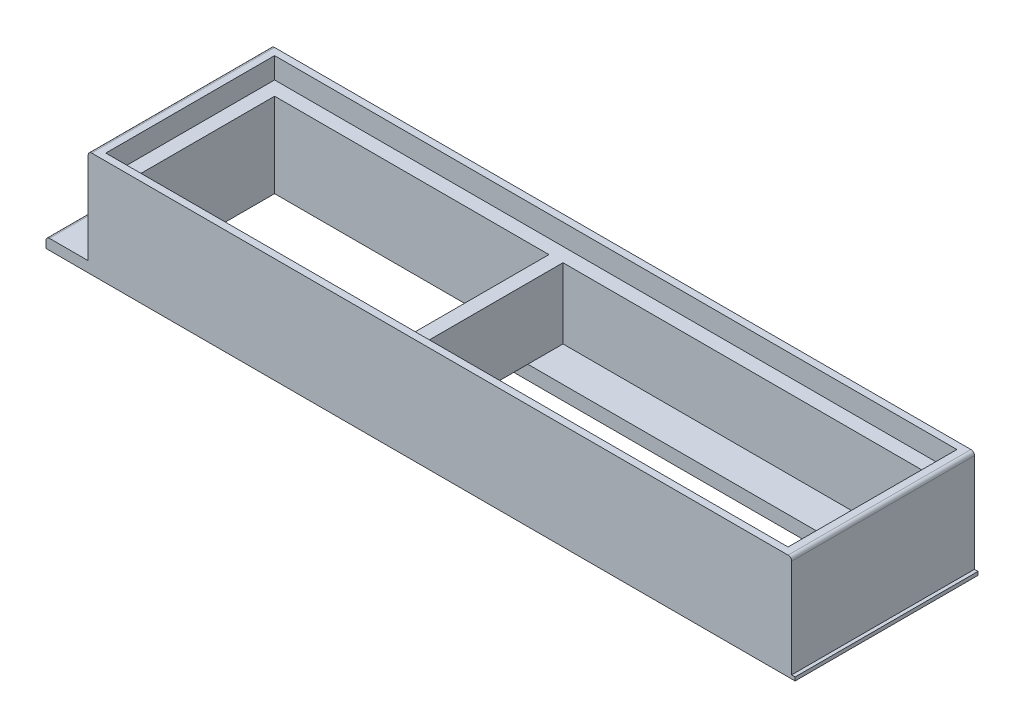
ISO-10303-21;
HEADER;
FILE_DESCRIPTION(('STEP AP214'),'2;1');
FILE_NAME('part.step','',(''),(''),'','','');
FILE_SCHEMA(('AUTOMOTIVE_DESIGN { 1 0 10303 214 1 1 1 1 }'));
ENDSEC;
DATA;
#1=APPLICATION_CONTEXT('core data for automotive mechanical design processes');
#2=APPLICATION_PROTOCOL_DEFINITION('international standard','automotive_design',2000,#1);
#3=PRODUCT_CONTEXT('',#1,'mechanical');
#4=PRODUCT('Part','Part','',(#3));
#5=PRODUCT_RELATED_PRODUCT_CATEGORY('part','',(#4));
#6=PRODUCT_DEFINITION_FORMATION('','',#4);
#7=PRODUCT_DEFINITION_CONTEXT('part definition',#1,'design');
#8=PRODUCT_DEFINITION('design','',#6,#7);
#9=PRODUCT_DEFINITION_SHAPE('','',#8);
#10=(LENGTH_UNIT() NAMED_UNIT(*) SI_UNIT(.MILLI.,.METRE.));
#11=(NAMED_UNIT(*) PLANE_ANGLE_UNIT() SI_UNIT($,.RADIAN.));
#12=(NAMED_UNIT(*) SI_UNIT($,.STERADIAN.) SOLID_ANGLE_UNIT());
#13=UNCERTAINTY_MEASURE_WITH_UNIT(LENGTH_MEASURE(1.E-05),#10,'distance_accuracy_value','');
#14=(GEOMETRIC_REPRESENTATION_CONTEXT(3) GLOBAL_UNCERTAINTY_ASSIGNED_CONTEXT((#13)) GLOBAL_UNIT_ASSIGNED_CONTEXT((#10,
#11,#12)) REPRESENTATION_CONTEXT('',''));
#15=CARTESIAN_POINT('',(0.,0.,0.));
#16=DIRECTION('',(0.,0.,1.));
#17=DIRECTION('',(1.,0.,0.));
#18=AXIS2_PLACEMENT_3D('',#15,#16,#17);
#19=CARTESIAN_POINT('',(9.5,-99.9249718538865,23.));
#20=DIRECTION('',(0.,0.,1.));
#21=DIRECTION('',(1.,0.,0.));
#22=AXIS2_PLACEMENT_3D('',#19,#20,#21);
#23=PLANE('',#22);
#24=DIRECTION('',(0.,1.,0.));
#25=VECTOR('',#24,1.);
#26=CARTESIAN_POINT('',(48.5,0.,23.));
#27=LINE('',#26,#25);
#28=CARTESIAN_POINT('',(48.5,0.,23.));
#29=VERTEX_POINT('',#28);
#30=CARTESIAN_POINT('',(48.5,12.,23.));
#31=VERTEX_POINT('',#30);
#32=EDGE_CURVE('E251',#29,#31,#27,.T.);
#33=ORIENTED_EDGE('',*,*,#32,.F.);
#34=DIRECTION('',(1.,0.,0.));
#35=VECTOR('',#34,1.);
#36=CARTESIAN_POINT('',(9.5,0.,23.));
#37=LINE('',#36,#35);
#38=CARTESIAN_POINT('',(9.5,0.,23.));
#39=VERTEX_POINT('',#38);
#40=EDGE_CURVE('E347',#39,#29,#37,.T.);
#41=ORIENTED_EDGE('',*,*,#40,.F.);
#42=DIRECTION('',(0.,1.,0.));
#43=VECTOR('',#42,1.);
#44=CARTESIAN_POINT('',(9.5,-99.9249718538865,23.));
#45=LINE('',#44,#43);
#46=CARTESIAN_POINT('',(9.5,12.,23.));
#47=VERTEX_POINT('',#46);
#48=EDGE_CURVE('E340',#39,#47,#45,.T.);
#49=ORIENTED_EDGE('',*,*,#48,.T.);
#50=DIRECTION('',(1.,0.,0.));
#51=VECTOR('',#50,1.);
#52=CARTESIAN_POINT('',(9.5,12.,23.));
#53=LINE('',#52,#51);
#54=EDGE_CURVE('E301',#47,#31,#53,.T.);
#55=ORIENTED_EDGE('',*,*,#54,.T.);
#56=EDGE_LOOP('',(#33,#41,#49,#55));
#57=FACE_BOUND('',#56,.T.);
#58=ADVANCED_FACE('F38',(#57),#23,.F.);
#59=DIRECTION('',(0.,-1.,0.));
#60=VECTOR('',#59,1.);
#61=CARTESIAN_POINT('',(50.5,0.,23.));
#62=LINE('',#61,#60);
#63=CARTESIAN_POINT('',(50.5,12.,23.));
#64=VERTEX_POINT('',#63);
#65=CARTESIAN_POINT('',(50.5,2.,23.));
#66=VERTEX_POINT('',#65);
#67=EDGE_CURVE('E248',#64,#66,#62,.T.);
#68=ORIENTED_EDGE('',*,*,#67,.F.);
#69=CARTESIAN_POINT('',(102.5,12.,23.));
#70=VERTEX_POINT('',#69);
#71=EDGE_CURVE('E300',#64,#70,#53,.T.);
#72=ORIENTED_EDGE('',*,*,#71,.T.);
#73=DIRECTION('',(0.,1.,0.));
#74=VECTOR('',#73,1.);
#75=CARTESIAN_POINT('',(102.5,-99.9249718538865,23.));
#76=LINE('',#75,#74);
#77=CARTESIAN_POINT('',(102.5,2.,23.));
#78=VERTEX_POINT('',#77);
#79=EDGE_CURVE('E354',#78,#70,#76,.T.);
#80=ORIENTED_EDGE('',*,*,#79,.F.);
#81=DIRECTION('',(1.,0.,0.));
#82=VECTOR('',#81,1.);
#83=CARTESIAN_POINT('',(102.5,2.,23.));
#84=LINE('',#83,#82);
#85=EDGE_CURVE('E271',#66,#78,#84,.T.);
#86=ORIENTED_EDGE('',*,*,#85,.F.);
#87=EDGE_LOOP('',(#68,#72,#80,#86));
#88=FACE_BOUND('',#87,.T.);
#89=ADVANCED_FACE('F470',(#88),#23,.F.);
#90=CARTESIAN_POINT('',(102.5,-99.9249718538865,3.));
#91=DIRECTION('',(0.,0.,-1.));
#92=DIRECTION('',(-1.,0.,0.));
#93=AXIS2_PLACEMENT_3D('',#90,#91,#92);
#94=PLANE('',#93);
#95=DIRECTION('',(0.,1.,0.));
#96=VECTOR('',#95,1.);
#97=CARTESIAN_POINT('',(48.5,0.,3.));
#98=LINE('',#97,#96);
#99=CARTESIAN_POINT('',(48.5,0.,3.));
#100=VERTEX_POINT('',#99);
#101=CARTESIAN_POINT('',(48.5,12.,3.));
#102=VERTEX_POINT('',#101);
#103=EDGE_CURVE('E231',#100,#102,#98,.T.);
#104=ORIENTED_EDGE('',*,*,#103,.T.);
#105=DIRECTION('',(-1.,0.,0.));
#106=VECTOR('',#105,1.);
#107=CARTESIAN_POINT('',(102.5,12.,3.));
#108=LINE('',#107,#106);
#109=CARTESIAN_POINT('',(9.5,12.,3.));
#110=VERTEX_POINT('',#109);
#111=EDGE_CURVE('E307',#102,#110,#108,.T.);
#112=ORIENTED_EDGE('',*,*,#111,.T.);
#113=DIRECTION('',(0.,1.,0.));
#114=VECTOR('',#113,1.);
#115=CARTESIAN_POINT('',(9.5,-99.9249718538865,3.));
#116=LINE('',#115,#114);
#117=CARTESIAN_POINT('',(9.5,0.,3.));
#118=VERTEX_POINT('',#117);
#119=EDGE_CURVE('E361',#118,#110,#116,.T.);
#120=ORIENTED_EDGE('',*,*,#119,.F.);
#121=DIRECTION('',(-1.,0.,0.));
#122=VECTOR('',#121,1.);
#123=CARTESIAN_POINT('',(102.5,0.,3.));
#124=LINE('',#123,#122);
#125=EDGE_CURVE('E355',#100,#118,#124,.T.);
#126=ORIENTED_EDGE('',*,*,#125,.F.);
#127=EDGE_LOOP('',(#104,#112,#120,#126));
#128=FACE_BOUND('',#127,.T.);
#129=ADVANCED_FACE('F476',(#128),#94,.F.);
#130=DIRECTION('',(0.,-1.,0.));
#131=VECTOR('',#130,1.);
#132=CARTESIAN_POINT('',(50.5,0.,3.));
#133=LINE('',#132,#131);
#134=CARTESIAN_POINT('',(50.5,12.,3.));
#135=VERTEX_POINT('',#134);
#136=CARTESIAN_POINT('',(50.5,1.99999999999999,3.));
#137=VERTEX_POINT('',#136);
#138=EDGE_CURVE('E261',#135,#137,#133,.T.);
#139=ORIENTED_EDGE('',*,*,#138,.T.);
#140=DIRECTION('',(-1.,0.,0.));
#141=VECTOR('',#140,1.);
#142=CARTESIAN_POINT('',(102.5,2.,3.));
#143=LINE('',#142,#141);
#144=CARTESIAN_POINT('',(102.5,2.,3.));
#145=VERTEX_POINT('',#144);
#146=EDGE_CURVE('E284',#145,#137,#143,.T.);
#147=ORIENTED_EDGE('',*,*,#146,.F.);
#148=DIRECTION('',(0.,1.,0.));
#149=VECTOR('',#148,1.);
#150=CARTESIAN_POINT('',(102.5,-99.9249718538865,3.));
#151=LINE('',#150,#149);
#152=CARTESIAN_POINT('',(102.5,12.,3.));
#153=VERTEX_POINT('',#152);
#154=EDGE_CURVE('E364',#145,#153,#151,.T.);
#155=ORIENTED_EDGE('',*,*,#154,.T.);
#156=EDGE_CURVE('E308',#153,#135,#108,.T.);
#157=ORIENTED_EDGE('',*,*,#156,.T.);
#158=EDGE_LOOP('',(#139,#147,#155,#157));
#159=FACE_BOUND('',#158,.T.);
#160=ADVANCED_FACE('F612',(#159),#94,.F.);
#161=CARTESIAN_POINT('',(102.5,-99.9249718538865,23.));
#162=DIRECTION('',(1.,0.,0.));
#163=DIRECTION('',(0.,0.,-1.));
#164=AXIS2_PLACEMENT_3D('',#161,#162,#163);
#165=PLANE('',#164);
#166=DIRECTION('',(0.,0.,1.));
#167=VECTOR('',#166,1.);
#168=CARTESIAN_POINT('',(102.5,2.,18.));
#169=LINE('',#168,#167);
#170=CARTESIAN_POINT('',(102.5,2.,18.));
#171=VERTEX_POINT('',#170);
#172=EDGE_CURVE('E277',#171,#78,#169,.T.);
#173=ORIENTED_EDGE('',*,*,#172,.T.);
#174=ORIENTED_EDGE('',*,*,#79,.T.);
#175=DIRECTION('',(0.,0.,-1.));
#176=VECTOR('',#175,1.);
#177=CARTESIAN_POINT('',(102.5,12.,23.));
#178=LINE('',#177,#176);
#179=EDGE_CURVE('E304',#70,#153,#178,.T.);
#180=ORIENTED_EDGE('',*,*,#179,.T.);
#181=ORIENTED_EDGE('',*,*,#154,.F.);
#182=DIRECTION('',(0.,0.,-1.));
#183=VECTOR('',#182,1.);
#184=CARTESIAN_POINT('',(102.5,2.,8.));
#185=LINE('',#184,#183);
#186=CARTESIAN_POINT('',(102.5,2.,8.));
#187=VERTEX_POINT('',#186);
#188=EDGE_CURVE('E298',#187,#145,#185,.T.);
#189=ORIENTED_EDGE('',*,*,#188,.F.);
#190=DIRECTION('',(0.,1.,0.));
#191=VECTOR('',#190,1.);
#192=CARTESIAN_POINT('',(102.5,0.,8.));
#193=LINE('',#192,#191);
#194=CARTESIAN_POINT('',(102.5,0.,8.));
#195=VERTEX_POINT('',#194);
#196=EDGE_CURVE('E285',#195,#187,#193,.T.);
#197=ORIENTED_EDGE('',*,*,#196,.F.);
#198=DIRECTION('',(0.,0.,-1.));
#199=VECTOR('',#198,1.);
#200=CARTESIAN_POINT('',(102.5,0.,23.));
#201=LINE('',#200,#199);
#202=CARTESIAN_POINT('',(102.5,0.,18.));
#203=VERTEX_POINT('',#202);
#204=EDGE_CURVE('E350',#203,#195,#201,.T.);
#205=ORIENTED_EDGE('',*,*,#204,.F.);
#206=DIRECTION('',(0.,-1.,0.));
#207=VECTOR('',#206,1.);
#208=CARTESIAN_POINT('',(102.5,0.,18.));
#209=LINE('',#208,#207);
#210=EDGE_CURVE('E272',#171,#203,#209,.T.);
#211=ORIENTED_EDGE('',*,*,#210,.F.);
#212=EDGE_LOOP('',(#173,#174,#180,#181,#189,#197,#205,#211));
#213=FACE_BOUND('',#212,.T.);
#214=ADVANCED_FACE('F511',(#213),#165,.F.);
#215=CARTESIAN_POINT('',(9.5,-99.9249718538865,3.));
#216=DIRECTION('',(-1.,0.,0.));
#217=DIRECTION('',(0.,0.,1.));
#218=AXIS2_PLACEMENT_3D('',#215,#216,#217);
#219=PLANE('',#218);
#220=DIRECTION('',(0.,0.,1.));
#221=VECTOR('',#220,1.);
#222=CARTESIAN_POINT('',(9.5,12.,3.));
#223=LINE('',#222,#221);
#224=EDGE_CURVE('E311',#110,#47,#223,.T.);
#225=ORIENTED_EDGE('',*,*,#224,.T.);
#226=ORIENTED_EDGE('',*,*,#48,.F.);
#227=DIRECTION('',(0.,0.,1.));
#228=VECTOR('',#227,1.);
#229=CARTESIAN_POINT('',(9.5,0.,3.));
#230=LINE('',#229,#228);
#231=EDGE_CURVE('E351',#118,#39,#230,.T.);
#232=ORIENTED_EDGE('',*,*,#231,.F.);
#233=ORIENTED_EDGE('',*,*,#119,.T.);
#234=EDGE_LOOP('',(#225,#226,#232,#233));
#235=FACE_BOUND('',#234,.T.);
#236=ADVANCED_FACE('F481',(#235),#219,.F.);
#237=CARTESIAN_POINT('',(0.,15.,0.));
#238=DIRECTION('',(0.,-1.,0.));
#239=DIRECTION('',(0.,0.,-1.));
#240=AXIS2_PLACEMENT_3D('',#237,#238,#239);
#241=PLANE('',#240);
#242=DIRECTION('',(1.,0.,0.));
#243=VECTOR('',#242,1.);
#244=CARTESIAN_POINT('',(7.5,15.,25.));
#245=LINE('',#244,#243);
#246=CARTESIAN_POINT('',(7.5,15.,25.));
#247=VERTEX_POINT('',#246);
#248=CARTESIAN_POINT('',(104.5,15.,25.));
#249=VERTEX_POINT('',#248);
#250=EDGE_CURVE('E330',#247,#249,#245,.T.);
#251=ORIENTED_EDGE('',*,*,#250,.F.);
#252=DIRECTION('',(0.,0.,1.));
#253=VECTOR('',#252,1.);
#254=CARTESIAN_POINT('',(7.5,15.,1.));
#255=LINE('',#254,#253);
#256=CARTESIAN_POINT('',(7.5,15.,1.));
#257=VERTEX_POINT('',#256);
#258=EDGE_CURVE('E314',#257,#247,#255,.T.);
#259=ORIENTED_EDGE('',*,*,#258,.F.);
#260=DIRECTION('',(-1.,0.,0.));
#261=VECTOR('',#260,1.);
#262=CARTESIAN_POINT('',(7.5,15.,1.));
#263=LINE('',#262,#261);
#264=CARTESIAN_POINT('',(104.5,15.,1.));
#265=VERTEX_POINT('',#264);
#266=EDGE_CURVE('E319',#265,#257,#263,.T.);
#267=ORIENTED_EDGE('',*,*,#266,.F.);
#268=DIRECTION('',(0.,0.,-1.));
#269=VECTOR('',#268,1.);
#270=CARTESIAN_POINT('',(104.5,15.,1.));
#271=LINE('',#270,#269);
#272=EDGE_CURVE('E333',#249,#265,#271,.T.);
#273=ORIENTED_EDGE('',*,*,#272,.F.);
#274=EDGE_LOOP('',(#251,#259,#267,#273));
#275=FACE_BOUND('',#274,.T.);
#276=DIRECTION('',(1.,0.,0.));
#277=VECTOR('',#276,1.);
#278=CARTESIAN_POINT('',(0.,15.,0.));
#279=LINE('',#278,#277);
#280=CARTESIAN_POINT('',(6.5,15.,0.));
#281=VERTEX_POINT('',#280);
#282=CARTESIAN_POINT('',(105.5,15.,0.));
#283=VERTEX_POINT('',#282);
#284=EDGE_CURVE('E401',#281,#283,#279,.T.);
#285=ORIENTED_EDGE('',*,*,#284,.F.);
#286=DIRECTION('',(0.,0.,1.));
#287=VECTOR('',#286,1.);
#288=CARTESIAN_POINT('',(6.5,15.,0.));
#289=LINE('',#288,#287);
#290=CARTESIAN_POINT('',(6.5,15.,26.));
#291=VERTEX_POINT('',#290);
#292=EDGE_CURVE('E421',#281,#291,#289,.T.);
#293=ORIENTED_EDGE('',*,*,#292,.T.);
#294=DIRECTION('',(1.,0.,0.));
#295=VECTOR('',#294,1.);
#296=CARTESIAN_POINT('',(0.,15.,26.));
#297=LINE('',#296,#295);
#298=CARTESIAN_POINT('',(105.5,15.,26.));
#299=VERTEX_POINT('',#298);
#300=EDGE_CURVE('E404',#291,#299,#297,.T.);
#301=ORIENTED_EDGE('',*,*,#300,.T.);
#302=DIRECTION('',(0.,0.,1.));
#303=VECTOR('',#302,1.);
#304=CARTESIAN_POINT('',(105.5,15.,0.));
#305=LINE('',#304,#303);
#306=EDGE_CURVE('E418',#299,#283,#305,.F.);
#307=ORIENTED_EDGE('',*,*,#306,.T.);
#308=EDGE_LOOP('',(#285,#293,#301,#307));
#309=FACE_BOUND('',#308,.T.);
#310=ADVANCED_FACE('F501',(#275,#309),#241,.F.);
#311=CARTESIAN_POINT('',(0.,15.,0.));
#312=DIRECTION('',(0.,0.,-1.));
#313=DIRECTION('',(-1.,0.,0.));
#314=AXIS2_PLACEMENT_3D('',#311,#312,#313);
#315=PLANE('',#314);
#316=DIRECTION('',(0.,-1.,0.));
#317=VECTOR('',#316,1.);
#318=CARTESIAN_POINT('',(106.5,0.,0.));
#319=LINE('',#318,#317);
#320=CARTESIAN_POINT('',(106.5,0.5,0.));
#321=VERTEX_POINT('',#320);
#322=CARTESIAN_POINT('',(106.5,0.,0.));
#323=VERTEX_POINT('',#322);
#324=EDGE_CURVE('E61',#321,#323,#319,.T.);
#325=ORIENTED_EDGE('',*,*,#324,.T.);
#326=DIRECTION('',(1.,0.,0.));
#327=VECTOR('',#326,1.);
#328=CARTESIAN_POINT('',(0.,0.,0.));
#329=LINE('',#328,#327);
#330=CARTESIAN_POINT('',(0.,0.,0.));
#331=VERTEX_POINT('',#330);
#332=EDGE_CURVE('E388',#331,#323,#329,.T.);
#333=ORIENTED_EDGE('',*,*,#332,.F.);
#334=DIRECTION('',(0.,-1.,0.));
#335=VECTOR('',#334,1.);
#336=CARTESIAN_POINT('',(0.,15.,0.));
#337=LINE('',#336,#335);
#338=CARTESIAN_POINT('',(0.,1.,0.));
#339=VERTEX_POINT('',#338);
#340=EDGE_CURVE('E416',#339,#331,#337,.T.);
#341=ORIENTED_EDGE('',*,*,#340,.F.);
#342=CARTESIAN_POINT('',(0.5,1.,0.));
#343=DIRECTION('',(0.,0.,-1.));
#344=DIRECTION('',(-1.,0.,0.));
#345=AXIS2_PLACEMENT_3D('',#342,#343,#344);
#346=CIRCLE('',#345,0.5);
#347=CARTESIAN_POINT('',(0.5,1.5,0.));
#348=VERTEX_POINT('',#347);
#349=EDGE_CURVE('E434',#339,#348,#346,.T.);
#350=ORIENTED_EDGE('',*,*,#349,.T.);
#351=DIRECTION('',(1.,0.,0.));
#352=VECTOR('',#351,1.);
#353=CARTESIAN_POINT('',(0.,1.5,0.));
#354=LINE('',#353,#352);
#355=CARTESIAN_POINT('',(6.,1.5,0.));
#356=VERTEX_POINT('',#355);
#357=EDGE_CURVE('E396',#348,#356,#354,.T.);
#358=ORIENTED_EDGE('',*,*,#357,.T.);
#359=DIRECTION('',(0.,1.,0.));
#360=VECTOR('',#359,1.);
#361=CARTESIAN_POINT('',(6.,15.,0.));
#362=LINE('',#361,#360);
#363=CARTESIAN_POINT('',(6.,14.5,0.));
#364=VERTEX_POINT('',#363);
#365=EDGE_CURVE('E392',#356,#364,#362,.T.);
#366=ORIENTED_EDGE('',*,*,#365,.T.);
#367=CARTESIAN_POINT('',(6.5,14.5,0.));
#368=DIRECTION('',(0.,0.,-1.));
#369=DIRECTION('',(-1.,0.,0.));
#370=AXIS2_PLACEMENT_3D('',#367,#368,#369);
#371=CIRCLE('',#370,0.5);
#372=EDGE_CURVE('E436',#364,#281,#371,.T.);
#373=ORIENTED_EDGE('',*,*,#372,.T.);
#374=ORIENTED_EDGE('',*,*,#284,.T.);
#375=CARTESIAN_POINT('',(105.5,14.5,0.));
#376=DIRECTION('',(0.,0.,-1.));
#377=DIRECTION('',(-1.,0.,0.));
#378=AXIS2_PLACEMENT_3D('',#375,#376,#377);
#379=CIRCLE('',#378,0.5);
#380=CARTESIAN_POINT('',(106.,14.5,0.));
#381=VERTEX_POINT('',#380);
#382=EDGE_CURVE('E432',#283,#381,#379,.T.);
#383=ORIENTED_EDGE('',*,*,#382,.T.);
#384=DIRECTION('',(0.,-1.,0.));
#385=VECTOR('',#384,1.);
#386=CARTESIAN_POINT('',(106.,15.,0.));
#387=LINE('',#386,#385);
#388=CARTESIAN_POINT('',(106.,0.5,0.));
#389=VERTEX_POINT('',#388);
#390=EDGE_CURVE('E374',#381,#389,#387,.T.);
#391=ORIENTED_EDGE('',*,*,#390,.T.);
#392=DIRECTION('',(1.,0.,0.));
#393=VECTOR('',#392,1.);
#394=CARTESIAN_POINT('',(107.,0.5,0.));
#395=LINE('',#394,#393);
#396=EDGE_CURVE('E376',#389,#321,#395,.T.);
#397=ORIENTED_EDGE('',*,*,#396,.T.);
#398=EDGE_LOOP('',(#325,#333,#341,#350,#358,#366,#373,#374,#383,#391,#397));
#399=FACE_BOUND('',#398,.T.);
#400=ADVANCED_FACE('F503',(#399),#315,.T.);
#401=CARTESIAN_POINT('',(0.,15.,0.));
#402=DIRECTION('',(1.,0.,0.));
#403=DIRECTION('',(0.,0.,-1.));
#404=AXIS2_PLACEMENT_3D('',#401,#402,#403);
#405=PLANE('',#404);
#406=DIRECTION('',(0.,-1.,0.));
#407=VECTOR('',#406,1.);
#408=CARTESIAN_POINT('',(0.,15.,26.));
#409=LINE('',#408,#407);
#410=CARTESIAN_POINT('',(0.,1.,26.));
#411=VERTEX_POINT('',#410);
#412=CARTESIAN_POINT('',(0.,0.,26.));
#413=VERTEX_POINT('',#412);
#414=EDGE_CURVE('E408',#411,#413,#409,.T.);
#415=ORIENTED_EDGE('',*,*,#414,.F.);
#416=DIRECTION('',(0.,0.,1.));
#417=VECTOR('',#416,1.);
#418=CARTESIAN_POINT('',(0.,1.,0.));
#419=LINE('',#418,#417);
#420=EDGE_CURVE('E441',#411,#339,#419,.F.);
#421=ORIENTED_EDGE('',*,*,#420,.T.);
#422=ORIENTED_EDGE('',*,*,#340,.T.);
#423=DIRECTION('',(0.,0.,1.));
#424=VECTOR('',#423,1.);
#425=CARTESIAN_POINT('',(0.,0.,0.));
#426=LINE('',#425,#424);
#427=EDGE_CURVE('E405',#331,#413,#426,.T.);
#428=ORIENTED_EDGE('',*,*,#427,.T.);
#429=EDGE_LOOP('',(#415,#421,#422,#428));
#430=FACE_BOUND('',#429,.T.);
#431=ADVANCED_FACE('F463',(#430),#405,.F.);
#432=CARTESIAN_POINT('',(0.,15.,26.));
#433=DIRECTION('',(0.,0.,-1.));
#434=DIRECTION('',(-1.,0.,0.));
#435=AXIS2_PLACEMENT_3D('',#432,#433,#434);
#436=PLANE('',#435);
#437=DIRECTION('',(1.,0.,0.));
#438=VECTOR('',#437,1.);
#439=CARTESIAN_POINT('',(0.,0.,26.));
#440=LINE('',#439,#438);
#441=CARTESIAN_POINT('',(106.5,0.,26.));
#442=VERTEX_POINT('',#441);
#443=EDGE_CURVE('E411',#413,#442,#440,.T.);
#444=ORIENTED_EDGE('',*,*,#443,.T.);
#445=DIRECTION('',(0.,-1.,0.));
#446=VECTOR('',#445,1.);
#447=CARTESIAN_POINT('',(106.5,0.,26.));
#448=LINE('',#447,#446);
#449=CARTESIAN_POINT('',(106.5,0.5,26.));
#450=VERTEX_POINT('',#449);
#451=EDGE_CURVE('E250',#450,#442,#448,.T.);
#452=ORIENTED_EDGE('',*,*,#451,.F.);
#453=DIRECTION('',(1.,0.,0.));
#454=VECTOR('',#453,1.);
#455=CARTESIAN_POINT('',(107.,0.5,26.));
#456=LINE('',#455,#454);
#457=CARTESIAN_POINT('',(106.,0.5,26.));
#458=VERTEX_POINT('',#457);
#459=EDGE_CURVE('E377',#458,#450,#456,.T.);
#460=ORIENTED_EDGE('',*,*,#459,.F.);
#461=DIRECTION('',(0.,-1.,0.));
#462=VECTOR('',#461,1.);
#463=CARTESIAN_POINT('',(106.,15.,26.));
#464=LINE('',#463,#462);
#465=CARTESIAN_POINT('',(106.,14.5,26.));
#466=VERTEX_POINT('',#465);
#467=EDGE_CURVE('E381',#466,#458,#464,.T.);
#468=ORIENTED_EDGE('',*,*,#467,.F.);
#469=CARTESIAN_POINT('',(105.5,14.5,26.));
#470=DIRECTION('',(0.,0.,-1.));
#471=DIRECTION('',(-1.,0.,0.));
#472=AXIS2_PLACEMENT_3D('',#469,#470,#471);
#473=CIRCLE('',#472,0.5);
#474=EDGE_CURVE('E424',#466,#299,#473,.F.);
#475=ORIENTED_EDGE('',*,*,#474,.T.);
#476=ORIENTED_EDGE('',*,*,#300,.F.);
#477=CARTESIAN_POINT('',(6.5,14.5,26.));
#478=DIRECTION('',(0.,0.,-1.));
#479=DIRECTION('',(-1.,0.,0.));
#480=AXIS2_PLACEMENT_3D('',#477,#478,#479);
#481=CIRCLE('',#480,0.5);
#482=CARTESIAN_POINT('',(6.,14.5,26.));
#483=VERTEX_POINT('',#482);
#484=EDGE_CURVE('E428',#291,#483,#481,.F.);
#485=ORIENTED_EDGE('',*,*,#484,.T.);
#486=DIRECTION('',(0.,1.,0.));
#487=VECTOR('',#486,1.);
#488=CARTESIAN_POINT('',(6.,15.,26.));
#489=LINE('',#488,#487);
#490=CARTESIAN_POINT('',(6.,1.5,26.));
#491=VERTEX_POINT('',#490);
#492=EDGE_CURVE('E393',#491,#483,#489,.T.);
#493=ORIENTED_EDGE('',*,*,#492,.F.);
#494=DIRECTION('',(1.,0.,0.));
#495=VECTOR('',#494,1.);
#496=CARTESIAN_POINT('',(0.,1.5,26.));
#497=LINE('',#496,#495);
#498=CARTESIAN_POINT('',(0.500000000000014,1.5,26.));
#499=VERTEX_POINT('',#498);
#500=EDGE_CURVE('E383',#499,#491,#497,.T.);
#501=ORIENTED_EDGE('',*,*,#500,.F.);
#502=CARTESIAN_POINT('',(0.500000000000014,1.,26.));
#503=DIRECTION('',(0.,0.,-1.));
#504=DIRECTION('',(-1.,0.,0.));
#505=AXIS2_PLACEMENT_3D('',#502,#503,#504);
#506=CIRCLE('',#505,0.5);
#507=EDGE_CURVE('E426',#499,#411,#506,.F.);
#508=ORIENTED_EDGE('',*,*,#507,.T.);
#509=ORIENTED_EDGE('',*,*,#414,.T.);
#510=EDGE_LOOP('',(#444,#452,#460,#468,#475,#476,#485,#493,#501,#508,#509));
#511=FACE_BOUND('',#510,.T.);
#512=ADVANCED_FACE('F453',(#511),#436,.F.);
#513=CARTESIAN_POINT('',(0.,0.,0.));
#514=DIRECTION('',(0.,-1.,0.));
#515=DIRECTION('',(0.,0.,-1.));
#516=AXIS2_PLACEMENT_3D('',#513,#514,#515);
#517=PLANE('',#516);
#518=DIRECTION('',(1.,0.,0.));
#519=VECTOR('',#518,1.);
#520=CARTESIAN_POINT('',(102.5,0.,8.));
#521=LINE('',#520,#519);
#522=CARTESIAN_POINT('',(48.5,0.,8.));
#523=VERTEX_POINT('',#522);
#524=EDGE_CURVE('E291',#523,#195,#521,.T.);
#525=ORIENTED_EDGE('',*,*,#524,.F.);
#526=DIRECTION('',(0.,0.,1.));
#527=VECTOR('',#526,1.);
#528=CARTESIAN_POINT('',(48.5,0.,-0.00199999999999853));
#529=LINE('',#528,#527);
#530=EDGE_CURVE('E255',#100,#523,#529,.T.);
#531=ORIENTED_EDGE('',*,*,#530,.F.);
#532=ORIENTED_EDGE('',*,*,#125,.T.);
#533=ORIENTED_EDGE('',*,*,#231,.T.);
#534=ORIENTED_EDGE('',*,*,#40,.T.);
#535=CARTESIAN_POINT('',(48.5,0.,18.));
#536=VERTEX_POINT('',#535);
#537=EDGE_CURVE('E258',#536,#29,#529,.T.);
#538=ORIENTED_EDGE('',*,*,#537,.F.);
#539=DIRECTION('',(-1.,0.,0.));
#540=VECTOR('',#539,1.);
#541=CARTESIAN_POINT('',(102.5,0.,18.));
#542=LINE('',#541,#540);
#543=EDGE_CURVE('E53',#203,#536,#542,.T.);
#544=ORIENTED_EDGE('',*,*,#543,.F.);
#545=ORIENTED_EDGE('',*,*,#204,.T.);
#546=EDGE_LOOP('',(#525,#531,#532,#533,#534,#538,#544,#545));
#547=FACE_BOUND('',#546,.T.);
#548=DIRECTION('',(0.,0.,1.));
#549=VECTOR('',#548,1.);
#550=CARTESIAN_POINT('',(106.5,0.,0.));
#551=LINE('',#550,#549);
#552=EDGE_CURVE('E267',#323,#442,#551,.T.);
#553=ORIENTED_EDGE('',*,*,#552,.T.);
#554=ORIENTED_EDGE('',*,*,#443,.F.);
#555=ORIENTED_EDGE('',*,*,#427,.F.);
#556=ORIENTED_EDGE('',*,*,#332,.T.);
#557=EDGE_LOOP('',(#553,#554,#555,#556));
#558=FACE_BOUND('',#557,.T.);
#559=CARTESIAN_POINT('',(3.,0.,13.));
#560=DIRECTION('',(0.,-1.,0.));
#561=DIRECTION('',(0.,0.,-1.));
#562=AXIS2_PLACEMENT_3D('',#559,#560,#561);
#563=CIRCLE('',#562,1.2);
#564=CARTESIAN_POINT('',(3.,0.,11.8));
#565=VERTEX_POINT('',#564);
#566=EDGE_CURVE('E373',#565,#565,#563,.T.);
#567=ORIENTED_EDGE('',*,*,#566,.F.);
#568=EDGE_LOOP('',(#567));
#569=FACE_BOUND('',#568,.T.);
#570=ADVANCED_FACE('F450',(#547,#558,#569),#517,.T.);
#571=CARTESIAN_POINT('',(6.,15.,0.));
#572=DIRECTION('',(1.,0.,0.));
#573=DIRECTION('',(0.,1.,0.));
#574=AXIS2_PLACEMENT_3D('',#571,#572,#573);
#575=PLANE('',#574);
#576=ORIENTED_EDGE('',*,*,#492,.T.);
#577=DIRECTION('',(0.,0.,1.));
#578=VECTOR('',#577,1.);
#579=CARTESIAN_POINT('',(6.,14.5,0.));
#580=LINE('',#579,#578);
#581=EDGE_CURVE('E430',#483,#364,#580,.F.);
#582=ORIENTED_EDGE('',*,*,#581,.T.);
#583=ORIENTED_EDGE('',*,*,#365,.F.);
#584=DIRECTION('',(0.,0.,1.));
#585=VECTOR('',#584,1.);
#586=CARTESIAN_POINT('',(6.,1.5,0.));
#587=LINE('',#586,#585);
#588=EDGE_CURVE('E389',#356,#491,#587,.T.);
#589=ORIENTED_EDGE('',*,*,#588,.T.);
#590=EDGE_LOOP('',(#576,#582,#583,#589));
#591=FACE_BOUND('',#590,.T.);
#592=ADVANCED_FACE('F452',(#591),#575,.F.);
#593=CARTESIAN_POINT('',(0.,1.5,0.));
#594=DIRECTION('',(0.,-1.,0.));
#595=DIRECTION('',(1.,0.,0.));
#596=AXIS2_PLACEMENT_3D('',#593,#594,#595);
#597=PLANE('',#596);
#598=CARTESIAN_POINT('',(3.,1.5,13.));
#599=DIRECTION('',(0.,1.,0.));
#600=DIRECTION('',(0.,0.,1.));
#601=AXIS2_PLACEMENT_3D('',#598,#599,#600);
#602=CIRCLE('',#601,2.2);
#603=CARTESIAN_POINT('',(3.,1.5,15.2));
#604=VERTEX_POINT('',#603);
#605=EDGE_CURVE('E357',#604,#604,#602,.T.);
#606=ORIENTED_EDGE('',*,*,#605,.F.);
#607=EDGE_LOOP('',(#606));
#608=FACE_BOUND('',#607,.T.);
#609=ORIENTED_EDGE('',*,*,#357,.F.);
#610=DIRECTION('',(0.,0.,1.));
#611=VECTOR('',#610,1.);
#612=CARTESIAN_POINT('',(0.5,1.5,0.));
#613=LINE('',#612,#611);
#614=EDGE_CURVE('E438',#348,#499,#613,.T.);
#615=ORIENTED_EDGE('',*,*,#614,.T.);
#616=ORIENTED_EDGE('',*,*,#500,.T.);
#617=ORIENTED_EDGE('',*,*,#588,.F.);
#618=EDGE_LOOP('',(#609,#615,#616,#617));
#619=FACE_BOUND('',#618,.T.);
#620=ADVANCED_FACE('F460',(#608,#619),#597,.F.);
#621=CARTESIAN_POINT('',(107.,0.5,0.));
#622=DIRECTION('',(0.,-1.,0.));
#623=DIRECTION('',(1.,0.,0.));
#624=AXIS2_PLACEMENT_3D('',#621,#622,#623);
#625=PLANE('',#624);
#626=ORIENTED_EDGE('',*,*,#459,.T.);
#627=DIRECTION('',(0.,0.,-1.));
#628=VECTOR('',#627,1.);
#629=CARTESIAN_POINT('',(106.5,0.5,0.));
#630=LINE('',#629,#628);
#631=EDGE_CURVE('E11',#450,#321,#630,.T.);
#632=ORIENTED_EDGE('',*,*,#631,.T.);
#633=ORIENTED_EDGE('',*,*,#396,.F.);
#634=DIRECTION('',(0.,0.,1.));
#635=VECTOR('',#634,1.);
#636=CARTESIAN_POINT('',(106.,0.5,0.));
#637=LINE('',#636,#635);
#638=EDGE_CURVE('E380',#389,#458,#637,.T.);
#639=ORIENTED_EDGE('',*,*,#638,.T.);
#640=EDGE_LOOP('',(#626,#632,#633,#639));
#641=FACE_BOUND('',#640,.T.);
#642=ADVANCED_FACE('F490',(#641),#625,.F.);
#643=CARTESIAN_POINT('',(106.,15.,0.));
#644=DIRECTION('',(-1.,0.,0.));
#645=DIRECTION('',(0.,0.,1.));
#646=AXIS2_PLACEMENT_3D('',#643,#644,#645);
#647=PLANE('',#646);
#648=ORIENTED_EDGE('',*,*,#390,.F.);
#649=DIRECTION('',(0.,0.,1.));
#650=VECTOR('',#649,1.);
#651=CARTESIAN_POINT('',(106.,14.5,0.));
#652=LINE('',#651,#650);
#653=EDGE_CURVE('E46',#381,#466,#652,.T.);
#654=ORIENTED_EDGE('',*,*,#653,.T.);
#655=ORIENTED_EDGE('',*,*,#467,.T.);
#656=ORIENTED_EDGE('',*,*,#638,.F.);
#657=EDGE_LOOP('',(#648,#654,#655,#656));
#658=FACE_BOUND('',#657,.T.);
#659=ADVANCED_FACE('F493',(#658),#647,.F.);
#660=CARTESIAN_POINT('',(6.5,14.5,0.));
#661=DIRECTION('',(0.,0.,1.));
#662=DIRECTION('',(1.,0.,0.));
#663=AXIS2_PLACEMENT_3D('',#660,#661,#662);
#664=CYLINDRICAL_SURFACE('',#663,0.5);
#665=ORIENTED_EDGE('',*,*,#372,.F.);
#666=ORIENTED_EDGE('',*,*,#581,.F.);
#667=ORIENTED_EDGE('',*,*,#484,.F.);
#668=ORIENTED_EDGE('',*,*,#292,.F.);
#669=EDGE_LOOP('',(#665,#666,#667,#668));
#670=FACE_BOUND('',#669,.T.);
#671=ADVANCED_FACE('F497',(#670),#664,.T.);
#672=CARTESIAN_POINT('',(0.5,1.,0.));
#673=DIRECTION('',(0.,0.,1.));
#674=DIRECTION('',(1.,0.,0.));
#675=AXIS2_PLACEMENT_3D('',#672,#673,#674);
#676=CYLINDRICAL_SURFACE('',#675,0.5);
#677=ORIENTED_EDGE('',*,*,#349,.F.);
#678=ORIENTED_EDGE('',*,*,#420,.F.);
#679=ORIENTED_EDGE('',*,*,#507,.F.);
#680=ORIENTED_EDGE('',*,*,#614,.F.);
#681=EDGE_LOOP('',(#677,#678,#679,#680));
#682=FACE_BOUND('',#681,.T.);
#683=ADVANCED_FACE('F540',(#682),#676,.T.);
#684=CARTESIAN_POINT('',(105.5,14.5,0.));
#685=DIRECTION('',(0.,0.,1.));
#686=DIRECTION('',(1.,0.,0.));
#687=AXIS2_PLACEMENT_3D('',#684,#685,#686);
#688=CYLINDRICAL_SURFACE('',#687,0.5);
#689=ORIENTED_EDGE('',*,*,#382,.F.);
#690=ORIENTED_EDGE('',*,*,#306,.F.);
#691=ORIENTED_EDGE('',*,*,#474,.F.);
#692=ORIENTED_EDGE('',*,*,#653,.F.);
#693=EDGE_LOOP('',(#689,#690,#691,#692));
#694=FACE_BOUND('',#693,.T.);
#695=ADVANCED_FACE('F40',(#694),#688,.T.);
#696=CARTESIAN_POINT('',(3.,1.5,13.));
#697=DIRECTION('',(0.,1.,0.));
#698=DIRECTION('',(0.,0.,1.));
#699=AXIS2_PLACEMENT_3D('',#696,#697,#698);
#700=CYLINDRICAL_SURFACE('',#699,1.2);
#701=ORIENTED_EDGE('',*,*,#566,.T.);
#702=EDGE_LOOP('',(#701));
#703=FACE_BOUND('',#702,.T.);
#704=CARTESIAN_POINT('',(3.,0.499999999999999,13.));
#705=DIRECTION('',(0.,1.,0.));
#706=DIRECTION('',(0.,0.,1.));
#707=AXIS2_PLACEMENT_3D('',#704,#705,#706);
#708=CIRCLE('',#707,1.2);
#709=CARTESIAN_POINT('',(3.,0.499999999999999,14.2));
#710=VERTEX_POINT('',#709);
#711=EDGE_CURVE('E370',#710,#710,#708,.T.);
#712=ORIENTED_EDGE('',*,*,#711,.T.);
#713=EDGE_LOOP('',(#712));
#714=FACE_BOUND('',#713,.T.);
#715=ADVANCED_FACE('F447',(#703,#714),#700,.F.);
#716=CARTESIAN_POINT('',(3.,1.5,13.));
#717=DIRECTION('',(0.,1.,0.));
#718=DIRECTION('',(0.,0.,1.));
#719=AXIS2_PLACEMENT_3D('',#716,#717,#718);
#720=CONICAL_SURFACE('',#719,2.2,0.785398163397449);
#721=ORIENTED_EDGE('',*,*,#711,.F.);
#722=EDGE_LOOP('',(#721));
#723=FACE_BOUND('',#722,.T.);
#724=ORIENTED_EDGE('',*,*,#605,.T.);
#725=EDGE_LOOP('',(#724));
#726=FACE_BOUND('',#725,.T.);
#727=ADVANCED_FACE('F483',(#723,#726),#720,.F.);
#728=CARTESIAN_POINT('',(7.5,12.,1.));
#729=DIRECTION('',(-1.,0.,0.));
#730=DIRECTION('',(0.,0.,1.));
#731=AXIS2_PLACEMENT_3D('',#728,#729,#730);
#732=PLANE('',#731);
#733=ORIENTED_EDGE('',*,*,#258,.T.);
#734=DIRECTION('',(0.,1.,0.));
#735=VECTOR('',#734,1.);
#736=CARTESIAN_POINT('',(7.5,12.,25.));
#737=LINE('',#736,#735);
#738=CARTESIAN_POINT('',(7.5,12.,25.));
#739=VERTEX_POINT('',#738);
#740=EDGE_CURVE('E328',#739,#247,#737,.T.);
#741=ORIENTED_EDGE('',*,*,#740,.F.);
#742=DIRECTION('',(0.,0.,1.));
#743=VECTOR('',#742,1.);
#744=CARTESIAN_POINT('',(7.5,12.,1.));
#745=LINE('',#744,#743);
#746=CARTESIAN_POINT('',(7.5,12.,1.));
#747=VERTEX_POINT('',#746);
#748=EDGE_CURVE('E315',#747,#739,#745,.T.);
#749=ORIENTED_EDGE('',*,*,#748,.F.);
#750=DIRECTION('',(0.,1.,0.));
#751=VECTOR('',#750,1.);
#752=CARTESIAN_POINT('',(7.5,12.,1.));
#753=LINE('',#752,#751);
#754=EDGE_CURVE('E338',#747,#257,#753,.T.);
#755=ORIENTED_EDGE('',*,*,#754,.T.);
#756=EDGE_LOOP('',(#733,#741,#749,#755));
#757=FACE_BOUND('',#756,.T.);
#758=ADVANCED_FACE('F486',(#757),#732,.F.);
#759=CARTESIAN_POINT('',(7.5,12.,1.));
#760=DIRECTION('',(0.,0.,-1.));
#761=DIRECTION('',(-1.,0.,0.));
#762=AXIS2_PLACEMENT_3D('',#759,#760,#761);
#763=PLANE('',#762);
#764=ORIENTED_EDGE('',*,*,#266,.T.);
#765=ORIENTED_EDGE('',*,*,#754,.F.);
#766=DIRECTION('',(-1.,0.,0.));
#767=VECTOR('',#766,1.);
#768=CARTESIAN_POINT('',(7.5,12.,1.));
#769=LINE('',#768,#767);
#770=CARTESIAN_POINT('',(104.5,12.,1.));
#771=VERTEX_POINT('',#770);
#772=EDGE_CURVE('E325',#771,#747,#769,.T.);
#773=ORIENTED_EDGE('',*,*,#772,.F.);
#774=DIRECTION('',(0.,1.,0.));
#775=VECTOR('',#774,1.);
#776=CARTESIAN_POINT('',(104.5,12.,1.));
#777=LINE('',#776,#775);
#778=EDGE_CURVE('E341',#771,#265,#777,.T.);
#779=ORIENTED_EDGE('',*,*,#778,.T.);
#780=EDGE_LOOP('',(#764,#765,#773,#779));
#781=FACE_BOUND('',#780,.T.);
#782=ADVANCED_FACE('F716',(#781),#763,.F.);
#783=CARTESIAN_POINT('',(104.5,12.,1.));
#784=DIRECTION('',(1.,0.,0.));
#785=DIRECTION('',(0.,0.,-1.));
#786=AXIS2_PLACEMENT_3D('',#783,#784,#785);
#787=PLANE('',#786);
#788=ORIENTED_EDGE('',*,*,#272,.T.);
#789=ORIENTED_EDGE('',*,*,#778,.F.);
#790=DIRECTION('',(0.,0.,-1.));
#791=VECTOR('',#790,1.);
#792=CARTESIAN_POINT('',(104.5,12.,1.));
#793=LINE('',#792,#791);
#794=CARTESIAN_POINT('',(104.5,12.,25.));
#795=VERTEX_POINT('',#794);
#796=EDGE_CURVE('E322',#795,#771,#793,.T.);
#797=ORIENTED_EDGE('',*,*,#796,.F.);
#798=DIRECTION('',(0.,1.,0.));
#799=VECTOR('',#798,1.);
#800=CARTESIAN_POINT('',(104.5,12.,25.));
#801=LINE('',#800,#799);
#802=EDGE_CURVE('E343',#795,#249,#801,.T.);
#803=ORIENTED_EDGE('',*,*,#802,.T.);
#804=EDGE_LOOP('',(#788,#789,#797,#803));
#805=FACE_BOUND('',#804,.T.);
#806=ADVANCED_FACE('F719',(#805),#787,.F.);
#807=CARTESIAN_POINT('',(7.5,12.,25.));
#808=DIRECTION('',(0.,0.,1.));
#809=DIRECTION('',(1.,0.,0.));
#810=AXIS2_PLACEMENT_3D('',#807,#808,#809);
#811=PLANE('',#810);
#812=ORIENTED_EDGE('',*,*,#250,.T.);
#813=ORIENTED_EDGE('',*,*,#802,.F.);
#814=DIRECTION('',(1.,0.,0.));
#815=VECTOR('',#814,1.);
#816=CARTESIAN_POINT('',(7.5,12.,25.));
#817=LINE('',#816,#815);
#818=EDGE_CURVE('E318',#739,#795,#817,.T.);
#819=ORIENTED_EDGE('',*,*,#818,.F.);
#820=ORIENTED_EDGE('',*,*,#740,.T.);
#821=EDGE_LOOP('',(#812,#813,#819,#820));
#822=FACE_BOUND('',#821,.T.);
#823=ADVANCED_FACE('F631',(#822),#811,.F.);
#824=CARTESIAN_POINT('',(0.,12.,0.));
#825=DIRECTION('',(0.,1.,0.));
#826=DIRECTION('',(0.,0.,1.));
#827=AXIS2_PLACEMENT_3D('',#824,#825,#826);
#828=PLANE('',#827);
#829=ORIENTED_EDGE('',*,*,#111,.F.);
#830=DIRECTION('',(0.,0.,1.));
#831=VECTOR('',#830,1.);
#832=CARTESIAN_POINT('',(48.5,12.,-0.00199999999999853));
#833=LINE('',#832,#831);
#834=EDGE_CURVE('E257',#102,#31,#833,.T.);
#835=ORIENTED_EDGE('',*,*,#834,.T.);
#836=ORIENTED_EDGE('',*,*,#54,.F.);
#837=ORIENTED_EDGE('',*,*,#224,.F.);
#838=EDGE_LOOP('',(#829,#835,#836,#837));
#839=FACE_BOUND('',#838,.T.);
#840=DIRECTION('',(0.,0.,1.));
#841=VECTOR('',#840,1.);
#842=CARTESIAN_POINT('',(50.5,12.,-0.00199999999999853));
#843=LINE('',#842,#841);
#844=EDGE_CURVE('E254',#135,#64,#843,.T.);
#845=ORIENTED_EDGE('',*,*,#844,.F.);
#846=ORIENTED_EDGE('',*,*,#156,.F.);
#847=ORIENTED_EDGE('',*,*,#179,.F.);
#848=ORIENTED_EDGE('',*,*,#71,.F.);
#849=EDGE_LOOP('',(#845,#846,#847,#848));
#850=FACE_BOUND('',#849,.T.);
#851=ORIENTED_EDGE('',*,*,#748,.T.);
#852=ORIENTED_EDGE('',*,*,#818,.T.);
#853=ORIENTED_EDGE('',*,*,#796,.T.);
#854=ORIENTED_EDGE('',*,*,#772,.T.);
#855=EDGE_LOOP('',(#851,#852,#853,#854));
#856=FACE_BOUND('',#855,.T.);
#857=ADVANCED_FACE('F625',(#839,#850,#856),#828,.T.);
#858=CARTESIAN_POINT('',(102.5,2.,8.));
#859=DIRECTION('',(0.,-1.,0.));
#860=DIRECTION('',(1.,0.,0.));
#861=AXIS2_PLACEMENT_3D('',#858,#859,#860);
#862=PLANE('',#861);
#863=ORIENTED_EDGE('',*,*,#146,.T.);
#864=DIRECTION('',(0.,0.,-1.));
#865=VECTOR('',#864,1.);
#866=CARTESIAN_POINT('',(50.5,1.99999999999999,8.));
#867=LINE('',#866,#865);
#868=CARTESIAN_POINT('',(50.5,2.,8.));
#869=VERTEX_POINT('',#868);
#870=EDGE_CURVE('E294',#869,#137,#867,.T.);
#871=ORIENTED_EDGE('',*,*,#870,.F.);
#872=DIRECTION('',(-1.,0.,0.));
#873=VECTOR('',#872,1.);
#874=CARTESIAN_POINT('',(102.5,2.,8.));
#875=LINE('',#874,#873);
#876=EDGE_CURVE('E288',#187,#869,#875,.T.);
#877=ORIENTED_EDGE('',*,*,#876,.F.);
#878=ORIENTED_EDGE('',*,*,#188,.T.);
#879=EDGE_LOOP('',(#863,#871,#877,#878));
#880=FACE_BOUND('',#879,.T.);
#881=ADVANCED_FACE('F630',(#880),#862,.F.);
#882=CARTESIAN_POINT('',(0.,0.,8.));
#883=DIRECTION('',(0.,0.,1.));
#884=DIRECTION('',(1.,0.,0.));
#885=AXIS2_PLACEMENT_3D('',#882,#883,#884);
#886=PLANE('',#885);
#887=ORIENTED_EDGE('',*,*,#196,.T.);
#888=ORIENTED_EDGE('',*,*,#876,.T.);
#889=DIRECTION('',(1.,0.,0.));
#890=VECTOR('',#889,1.);
#891=CARTESIAN_POINT('',(-0.001000000000001,2.,8.));
#892=LINE('',#891,#890);
#893=CARTESIAN_POINT('',(48.5,2.,8.));
#894=VERTEX_POINT('',#893);
#895=EDGE_CURVE('E232',#894,#869,#892,.T.);
#896=ORIENTED_EDGE('',*,*,#895,.F.);
#897=DIRECTION('',(0.,-1.,0.));
#898=VECTOR('',#897,1.);
#899=CARTESIAN_POINT('',(48.5,0.,8.));
#900=LINE('',#899,#898);
#901=EDGE_CURVE('E242',#894,#523,#900,.T.);
#902=ORIENTED_EDGE('',*,*,#901,.T.);
#903=ORIENTED_EDGE('',*,*,#524,.T.);
#904=EDGE_LOOP('',(#887,#888,#896,#902,#903));
#905=FACE_BOUND('',#904,.T.);
#906=ADVANCED_FACE('F652',(#905),#886,.T.);
#907=CARTESIAN_POINT('',(102.5,2.,18.));
#908=DIRECTION('',(0.,-1.,0.));
#909=DIRECTION('',(1.,0.,0.));
#910=AXIS2_PLACEMENT_3D('',#907,#908,#909);
#911=PLANE('',#910);
#912=ORIENTED_EDGE('',*,*,#85,.T.);
#913=ORIENTED_EDGE('',*,*,#172,.F.);
#914=DIRECTION('',(1.,0.,0.));
#915=VECTOR('',#914,1.);
#916=CARTESIAN_POINT('',(102.5,2.,18.));
#917=LINE('',#916,#915);
#918=CARTESIAN_POINT('',(50.5,2.,18.));
#919=VERTEX_POINT('',#918);
#920=EDGE_CURVE('E275',#919,#171,#917,.T.);
#921=ORIENTED_EDGE('',*,*,#920,.F.);
#922=DIRECTION('',(0.,0.,1.));
#923=VECTOR('',#922,1.);
#924=CARTESIAN_POINT('',(50.5,2.,18.));
#925=LINE('',#924,#923);
#926=EDGE_CURVE('E281',#919,#66,#925,.T.);
#927=ORIENTED_EDGE('',*,*,#926,.T.);
#928=EDGE_LOOP('',(#912,#913,#921,#927));
#929=FACE_BOUND('',#928,.T.);
#930=ADVANCED_FACE('F665',(#929),#911,.F.);
#931=CARTESIAN_POINT('',(0.,0.,18.));
#932=DIRECTION('',(0.,0.,1.));
#933=DIRECTION('',(1.,0.,0.));
#934=AXIS2_PLACEMENT_3D('',#931,#932,#933);
#935=PLANE('',#934);
#936=ORIENTED_EDGE('',*,*,#210,.T.);
#937=ORIENTED_EDGE('',*,*,#543,.T.);
#938=DIRECTION('',(0.,1.,0.));
#939=VECTOR('',#938,1.);
#940=CARTESIAN_POINT('',(48.5,0.,18.));
#941=LINE('',#940,#939);
#942=CARTESIAN_POINT('',(48.5,2.,18.));
#943=VERTEX_POINT('',#942);
#944=EDGE_CURVE('E234',#536,#943,#941,.T.);
#945=ORIENTED_EDGE('',*,*,#944,.T.);
#946=DIRECTION('',(1.,0.,0.));
#947=VECTOR('',#946,1.);
#948=CARTESIAN_POINT('',(-0.001000000000001,2.,18.));
#949=LINE('',#948,#947);
#950=EDGE_CURVE('E223',#943,#919,#949,.T.);
#951=ORIENTED_EDGE('',*,*,#950,.T.);
#952=ORIENTED_EDGE('',*,*,#920,.T.);
#953=EDGE_LOOP('',(#936,#937,#945,#951,#952));
#954=FACE_BOUND('',#953,.T.);
#955=ADVANCED_FACE('F235',(#954),#935,.F.);
#956=CARTESIAN_POINT('',(106.5,0.,0.));
#957=DIRECTION('',(-1.,0.,0.));
#958=DIRECTION('',(0.,0.,1.));
#959=AXIS2_PLACEMENT_3D('',#956,#957,#958);
#960=PLANE('',#959);
#961=ORIENTED_EDGE('',*,*,#451,.T.);
#962=ORIENTED_EDGE('',*,*,#552,.F.);
#963=ORIENTED_EDGE('',*,*,#324,.F.);
#964=ORIENTED_EDGE('',*,*,#631,.F.);
#965=EDGE_LOOP('',(#961,#962,#963,#964));
#966=FACE_BOUND('',#965,.T.);
#967=ADVANCED_FACE('F582',(#966),#960,.F.);
#968=CARTESIAN_POINT('',(50.5,0.,-0.00199999999999853));
#969=DIRECTION('',(-1.,0.,0.));
#970=DIRECTION('',(0.,0.,1.));
#971=AXIS2_PLACEMENT_3D('',#968,#969,#970);
#972=PLANE('',#971);
#973=ORIENTED_EDGE('',*,*,#926,.F.);
#974=DIRECTION('',(0.,0.,1.));
#975=VECTOR('',#974,1.);
#976=CARTESIAN_POINT('',(50.5,2.,18.));
#977=LINE('',#976,#975);
#978=EDGE_CURVE('E229',#869,#919,#977,.T.);
#979=ORIENTED_EDGE('',*,*,#978,.F.);
#980=ORIENTED_EDGE('',*,*,#870,.T.);
#981=ORIENTED_EDGE('',*,*,#138,.F.);
#982=ORIENTED_EDGE('',*,*,#844,.T.);
#983=ORIENTED_EDGE('',*,*,#67,.T.);
#984=EDGE_LOOP('',(#973,#979,#980,#981,#982,#983));
#985=FACE_BOUND('',#984,.T.);
#986=ADVANCED_FACE('F586',(#985),#972,.F.);
#987=CARTESIAN_POINT('',(48.5,0.,-0.00199999999999853));
#988=DIRECTION('',(1.,0.,0.));
#989=DIRECTION('',(0.,0.,-1.));
#990=AXIS2_PLACEMENT_3D('',#987,#988,#989);
#991=PLANE('',#990);
#992=ORIENTED_EDGE('',*,*,#530,.T.);
#993=ORIENTED_EDGE('',*,*,#901,.F.);
#994=DIRECTION('',(0.,0.,-1.));
#995=VECTOR('',#994,1.);
#996=CARTESIAN_POINT('',(48.5,2.,18.));
#997=LINE('',#996,#995);
#998=EDGE_CURVE('E226',#943,#894,#997,.T.);
#999=ORIENTED_EDGE('',*,*,#998,.F.);
#1000=ORIENTED_EDGE('',*,*,#944,.F.);
#1001=ORIENTED_EDGE('',*,*,#537,.T.);
#1002=ORIENTED_EDGE('',*,*,#32,.T.);
#1003=ORIENTED_EDGE('',*,*,#834,.F.);
#1004=ORIENTED_EDGE('',*,*,#103,.F.);
#1005=EDGE_LOOP('',(#992,#993,#999,#1000,#1001,#1002,#1003,#1004));
#1006=FACE_BOUND('',#1005,.T.);
#1007=ADVANCED_FACE('F240',(#1006),#991,.F.);
#1008=CARTESIAN_POINT('',(-0.001000000000001,2.,18.));
#1009=DIRECTION('',(0.,1.,0.));
#1010=DIRECTION('',(0.,0.,1.));
#1011=AXIS2_PLACEMENT_3D('',#1008,#1009,#1010);
#1012=PLANE('',#1011);
#1013=ORIENTED_EDGE('',*,*,#998,.T.);
#1014=ORIENTED_EDGE('',*,*,#895,.T.);
#1015=ORIENTED_EDGE('',*,*,#978,.T.);
#1016=ORIENTED_EDGE('',*,*,#950,.F.);
#1017=EDGE_LOOP('',(#1013,#1014,#1015,#1016));
#1018=FACE_BOUND('',#1017,.T.);
#1019=ADVANCED_FACE('F224',(#1018),#1012,.F.);
#1020=CLOSED_SHELL('',(#58,#89,#129,#160,#214,#236,#310,#400,#431,#512,#570,#592,#620,#642,#659,
#671,#683,#695,#715,#727,#758,#782,#806,#823,#857,#881,#906,#930,#955,#967,#986,#1007,#1019));
#1021=MANIFOLD_SOLID_BREP('B2',#1020);
#1022=ADVANCED_BREP_SHAPE_REPRESENTATION('',(#18,#1021),#14);
#1023=SHAPE_DEFINITION_REPRESENTATION(#9,#1022);
ENDSEC;
END-ISO-10303-21;
